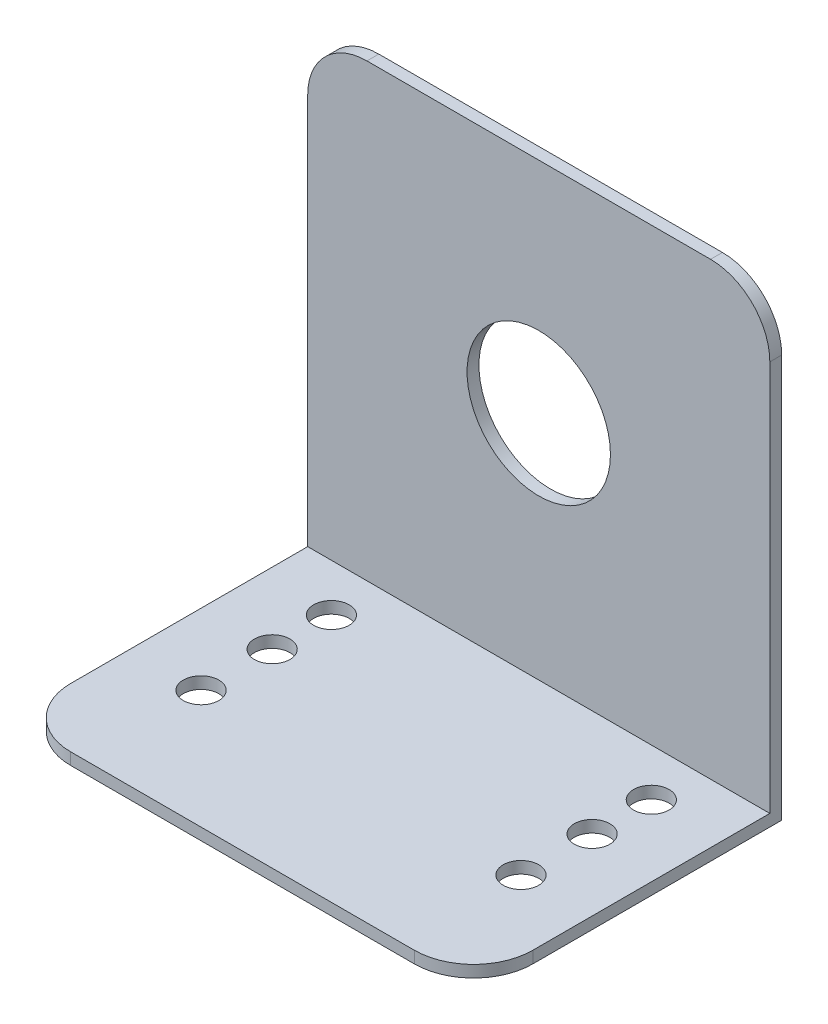
ISO-10303-21;
HEADER;
FILE_DESCRIPTION(('STEP AP214'),'2;1');
FILE_NAME('part.step','',(''),(''),'','','');
FILE_SCHEMA(('AUTOMOTIVE_DESIGN { 1 0 10303 214 1 1 1 1 }'));
ENDSEC;
DATA;
#1=APPLICATION_CONTEXT('core data for automotive mechanical design processes');
#2=APPLICATION_PROTOCOL_DEFINITION('international standard','automotive_design',2000,#1);
#3=PRODUCT_CONTEXT('',#1,'mechanical');
#4=PRODUCT('Part','Part','',(#3));
#5=PRODUCT_RELATED_PRODUCT_CATEGORY('part','',(#4));
#6=PRODUCT_DEFINITION_FORMATION('','',#4);
#7=PRODUCT_DEFINITION_CONTEXT('part definition',#1,'design');
#8=PRODUCT_DEFINITION('design','',#6,#7);
#9=PRODUCT_DEFINITION_SHAPE('','',#8);
#10=(LENGTH_UNIT() NAMED_UNIT(*) SI_UNIT(.MILLI.,.METRE.));
#11=(NAMED_UNIT(*) PLANE_ANGLE_UNIT() SI_UNIT($,.RADIAN.));
#12=(NAMED_UNIT(*) SI_UNIT($,.STERADIAN.) SOLID_ANGLE_UNIT());
#13=UNCERTAINTY_MEASURE_WITH_UNIT(LENGTH_MEASURE(1.E-05),#10,'distance_accuracy_value','');
#14=(GEOMETRIC_REPRESENTATION_CONTEXT(3) GLOBAL_UNCERTAINTY_ASSIGNED_CONTEXT((#13)) GLOBAL_UNIT_ASSIGNED_CONTEXT((#10,
#11,#12)) REPRESENTATION_CONTEXT('',''));
#15=CARTESIAN_POINT('',(0.,0.,0.));
#16=DIRECTION('',(0.,0.,1.));
#17=DIRECTION('',(1.,0.,0.));
#18=AXIS2_PLACEMENT_3D('',#15,#16,#17);
#19=CARTESIAN_POINT('',(0.,0.,1.));
#20=DIRECTION('',(0.,0.,-1.));
#21=DIRECTION('',(-1.,0.,0.));
#22=AXIS2_PLACEMENT_3D('',#19,#20,#21);
#23=PLANE('',#22);
#24=CARTESIAN_POINT('',(0.,1.,1.));
#25=DIRECTION('',(0.,0.,1.));
#26=DIRECTION('',(1.,0.,0.));
#27=AXIS2_PLACEMENT_3D('',#24,#25,#26);
#28=CIRCLE('',#27,6.05);
#29=CARTESIAN_POINT('',(6.05,1.,1.));
#30=VERTEX_POINT('',#29);
#31=EDGE_CURVE('E400',#30,#30,#28,.T.);
#32=ORIENTED_EDGE('',*,*,#31,.F.);
#33=EDGE_LOOP('',(#32));
#34=FACE_BOUND('',#33,.T.);
#35=DIRECTION('',(0.,1.,0.));
#36=VECTOR('',#35,1.);
#37=CARTESIAN_POINT('',(19.5,-19.5,1.));
#38=LINE('',#37,#36);
#39=CARTESIAN_POINT('',(19.5,-18.5,1.));
#40=VERTEX_POINT('',#39);
#41=CARTESIAN_POINT('',(19.5,14.5,1.));
#42=VERTEX_POINT('',#41);
#43=EDGE_CURVE('E146',#40,#42,#38,.T.);
#44=ORIENTED_EDGE('',*,*,#43,.T.);
#45=CARTESIAN_POINT('',(14.5,14.5,1.));
#46=DIRECTION('',(0.,0.,-1.));
#47=DIRECTION('',(-1.,0.,0.));
#48=AXIS2_PLACEMENT_3D('',#45,#46,#47);
#49=CIRCLE('',#48,5.);
#50=CARTESIAN_POINT('',(14.5,19.5,1.));
#51=VERTEX_POINT('',#50);
#52=EDGE_CURVE('E11',#42,#51,#49,.F.);
#53=ORIENTED_EDGE('',*,*,#52,.T.);
#54=DIRECTION('',(-1.,0.,0.));
#55=VECTOR('',#54,1.);
#56=CARTESIAN_POINT('',(-19.5,19.5,1.));
#57=LINE('',#56,#55);
#58=CARTESIAN_POINT('',(-14.5,19.5,1.));
#59=VERTEX_POINT('',#58);
#60=EDGE_CURVE('E119',#51,#59,#57,.T.);
#61=ORIENTED_EDGE('',*,*,#60,.T.);
#62=CARTESIAN_POINT('',(-14.5,14.5,1.));
#63=DIRECTION('',(0.,0.,-1.));
#64=DIRECTION('',(-1.,0.,0.));
#65=AXIS2_PLACEMENT_3D('',#62,#63,#64);
#66=CIRCLE('',#65,5.);
#67=CARTESIAN_POINT('',(-19.5,14.5,1.));
#68=VERTEX_POINT('',#67);
#69=EDGE_CURVE('E41',#59,#68,#66,.F.);
#70=ORIENTED_EDGE('',*,*,#69,.T.);
#71=DIRECTION('',(0.,-1.,0.));
#72=VECTOR('',#71,1.);
#73=CARTESIAN_POINT('',(-19.5,-19.5,1.));
#74=LINE('',#73,#72);
#75=CARTESIAN_POINT('',(-19.5,-18.5,1.));
#76=VERTEX_POINT('',#75);
#77=EDGE_CURVE('E109',#68,#76,#74,.T.);
#78=ORIENTED_EDGE('',*,*,#77,.T.);
#79=DIRECTION('',(-1.,0.,0.));
#80=VECTOR('',#79,1.);
#81=CARTESIAN_POINT('',(19.5,-18.5,1.));
#82=LINE('',#81,#80);
#83=EDGE_CURVE('E112',#40,#76,#82,.T.);
#84=ORIENTED_EDGE('',*,*,#83,.F.);
#85=EDGE_LOOP('',(#44,#53,#61,#70,#78,#84));
#86=FACE_BOUND('',#85,.T.);
#87=ADVANCED_FACE('F33',(#34,#86),#23,.F.);
#88=CARTESIAN_POINT('',(19.5,-19.5,1.));
#89=DIRECTION('',(-1.,0.,0.));
#90=DIRECTION('',(0.,0.,1.));
#91=AXIS2_PLACEMENT_3D('',#88,#89,#90);
#92=PLANE('',#91);
#93=DIRECTION('',(0.,0.,-1.));
#94=VECTOR('',#93,1.);
#95=CARTESIAN_POINT('',(19.5,-18.5,26.));
#96=LINE('',#95,#94);
#97=CARTESIAN_POINT('',(19.5,-18.5,21.));
#98=VERTEX_POINT('',#97);
#99=EDGE_CURVE('E129',#98,#40,#96,.T.);
#100=ORIENTED_EDGE('',*,*,#99,.F.);
#101=DIRECTION('',(0.,1.,0.));
#102=VECTOR('',#101,1.);
#103=CARTESIAN_POINT('',(19.5,-19.5,21.));
#104=LINE('',#103,#102);
#105=CARTESIAN_POINT('',(19.5,-19.5,21.));
#106=VERTEX_POINT('',#105);
#107=EDGE_CURVE('E181',#98,#106,#104,.F.);
#108=ORIENTED_EDGE('',*,*,#107,.T.);
#109=DIRECTION('',(0.,0.,-1.));
#110=VECTOR('',#109,1.);
#111=CARTESIAN_POINT('',(19.5,-19.5,1.));
#112=LINE('',#111,#110);
#113=CARTESIAN_POINT('',(19.5,-19.5,0.));
#114=VERTEX_POINT('',#113);
#115=EDGE_CURVE('E118',#106,#114,#112,.T.);
#116=ORIENTED_EDGE('',*,*,#115,.T.);
#117=DIRECTION('',(0.,1.,0.));
#118=VECTOR('',#117,1.);
#119=CARTESIAN_POINT('',(19.5,-19.5,0.));
#120=LINE('',#119,#118);
#121=CARTESIAN_POINT('',(19.5,14.5,0.));
#122=VERTEX_POINT('',#121);
#123=EDGE_CURVE('E145',#114,#122,#120,.T.);
#124=ORIENTED_EDGE('',*,*,#123,.T.);
#125=DIRECTION('',(0.,0.,-1.));
#126=VECTOR('',#125,1.);
#127=CARTESIAN_POINT('',(19.5,14.5,1.));
#128=LINE('',#127,#126);
#129=EDGE_CURVE('E179',#122,#42,#128,.F.);
#130=ORIENTED_EDGE('',*,*,#129,.T.);
#131=ORIENTED_EDGE('',*,*,#43,.F.);
#132=EDGE_LOOP('',(#100,#108,#116,#124,#130,#131));
#133=FACE_BOUND('',#132,.T.);
#134=ADVANCED_FACE('F199',(#133),#92,.F.);
#135=CARTESIAN_POINT('',(-19.5,19.5,1.));
#136=DIRECTION('',(0.,-1.,0.));
#137=DIRECTION('',(0.,0.,-1.));
#138=AXIS2_PLACEMENT_3D('',#135,#136,#137);
#139=PLANE('',#138);
#140=ORIENTED_EDGE('',*,*,#60,.F.);
#141=DIRECTION('',(0.,0.,-1.));
#142=VECTOR('',#141,1.);
#143=CARTESIAN_POINT('',(14.5,19.5,1.));
#144=LINE('',#143,#142);
#145=CARTESIAN_POINT('',(14.5,19.5,0.));
#146=VERTEX_POINT('',#145);
#147=EDGE_CURVE('E184',#51,#146,#144,.T.);
#148=ORIENTED_EDGE('',*,*,#147,.T.);
#149=DIRECTION('',(-1.,0.,0.));
#150=VECTOR('',#149,1.);
#151=CARTESIAN_POINT('',(-19.5,19.5,0.));
#152=LINE('',#151,#150);
#153=CARTESIAN_POINT('',(-14.5,19.5,0.));
#154=VERTEX_POINT('',#153);
#155=EDGE_CURVE('E152',#146,#154,#152,.T.);
#156=ORIENTED_EDGE('',*,*,#155,.T.);
#157=DIRECTION('',(0.,0.,-1.));
#158=VECTOR('',#157,1.);
#159=CARTESIAN_POINT('',(-14.5,19.5,1.));
#160=LINE('',#159,#158);
#161=EDGE_CURVE('E48',#154,#59,#160,.F.);
#162=ORIENTED_EDGE('',*,*,#161,.T.);
#163=EDGE_LOOP('',(#140,#148,#156,#162));
#164=FACE_BOUND('',#163,.T.);
#165=ADVANCED_FACE('F202',(#164),#139,.F.);
#166=CARTESIAN_POINT('',(-19.5,-19.5,1.));
#167=DIRECTION('',(1.,0.,0.));
#168=DIRECTION('',(0.,0.,-1.));
#169=AXIS2_PLACEMENT_3D('',#166,#167,#168);
#170=PLANE('',#169);
#171=DIRECTION('',(0.,0.,-1.));
#172=VECTOR('',#171,1.);
#173=CARTESIAN_POINT('',(-19.5,-19.5,1.));
#174=LINE('',#173,#172);
#175=CARTESIAN_POINT('',(-19.5,-19.5,21.));
#176=VERTEX_POINT('',#175);
#177=CARTESIAN_POINT('',(-19.5,-19.5,0.));
#178=VERTEX_POINT('',#177);
#179=EDGE_CURVE('E159',#176,#178,#174,.T.);
#180=ORIENTED_EDGE('',*,*,#179,.F.);
#181=DIRECTION('',(0.,-1.,0.));
#182=VECTOR('',#181,1.);
#183=CARTESIAN_POINT('',(-19.5,-18.5,21.));
#184=LINE('',#183,#182);
#185=CARTESIAN_POINT('',(-19.5,-18.5,21.));
#186=VERTEX_POINT('',#185);
#187=EDGE_CURVE('E126',#176,#186,#184,.F.);
#188=ORIENTED_EDGE('',*,*,#187,.T.);
#189=DIRECTION('',(0.,0.,-1.));
#190=VECTOR('',#189,1.);
#191=CARTESIAN_POINT('',(-19.5,-18.5,26.));
#192=LINE('',#191,#190);
#193=EDGE_CURVE('E122',#186,#76,#192,.T.);
#194=ORIENTED_EDGE('',*,*,#193,.T.);
#195=ORIENTED_EDGE('',*,*,#77,.F.);
#196=DIRECTION('',(0.,0.,-1.));
#197=VECTOR('',#196,1.);
#198=CARTESIAN_POINT('',(-19.5,14.5,1.));
#199=LINE('',#198,#197);
#200=CARTESIAN_POINT('',(-19.5,14.5,0.));
#201=VERTEX_POINT('',#200);
#202=EDGE_CURVE('E172',#68,#201,#199,.T.);
#203=ORIENTED_EDGE('',*,*,#202,.T.);
#204=DIRECTION('',(0.,-1.,0.));
#205=VECTOR('',#204,1.);
#206=CARTESIAN_POINT('',(-19.5,-19.5,0.));
#207=LINE('',#206,#205);
#208=EDGE_CURVE('E154',#201,#178,#207,.T.);
#209=ORIENTED_EDGE('',*,*,#208,.T.);
#210=EDGE_LOOP('',(#180,#188,#194,#195,#203,#209));
#211=FACE_BOUND('',#210,.T.);
#212=ADVANCED_FACE('F124',(#211),#170,.F.);
#213=CARTESIAN_POINT('',(-19.5,-19.5,1.));
#214=DIRECTION('',(0.,1.,0.));
#215=DIRECTION('',(0.,0.,1.));
#216=AXIS2_PLACEMENT_3D('',#213,#214,#215);
#217=PLANE('',#216);
#218=CARTESIAN_POINT('',(-13.5,-19.5,10.));
#219=DIRECTION('',(0.,-1.,0.));
#220=DIRECTION('',(0.,0.,-1.));
#221=AXIS2_PLACEMENT_3D('',#218,#219,#220);
#222=CIRCLE('',#221,1.5);
#223=CARTESIAN_POINT('',(-13.5,-19.5,8.5));
#224=VERTEX_POINT('',#223);
#225=EDGE_CURVE('E412',#224,#224,#222,.T.);
#226=ORIENTED_EDGE('',*,*,#225,.F.);
#227=EDGE_LOOP('',(#226));
#228=FACE_BOUND('',#227,.T.);
#229=CARTESIAN_POINT('',(-13.5,-19.5,5.));
#230=DIRECTION('',(0.,-1.,0.));
#231=DIRECTION('',(0.,0.,-1.));
#232=AXIS2_PLACEMENT_3D('',#229,#230,#231);
#233=CIRCLE('',#232,1.5);
#234=CARTESIAN_POINT('',(-13.5,-19.5,3.5));
#235=VERTEX_POINT('',#234);
#236=EDGE_CURVE('E405',#235,#235,#233,.T.);
#237=ORIENTED_EDGE('',*,*,#236,.F.);
#238=EDGE_LOOP('',(#237));
#239=FACE_BOUND('',#238,.T.);
#240=CARTESIAN_POINT('',(-13.5,-19.5,16.));
#241=DIRECTION('',(0.,-1.,0.));
#242=DIRECTION('',(0.,0.,-1.));
#243=AXIS2_PLACEMENT_3D('',#240,#241,#242);
#244=CIRCLE('',#243,1.5);
#245=CARTESIAN_POINT('',(-13.5,-19.5,14.5));
#246=VERTEX_POINT('',#245);
#247=EDGE_CURVE('E411',#246,#246,#244,.T.);
#248=ORIENTED_EDGE('',*,*,#247,.F.);
#249=EDGE_LOOP('',(#248));
#250=FACE_BOUND('',#249,.T.);
#251=CARTESIAN_POINT('',(13.5,-19.5,10.));
#252=DIRECTION('',(0.,-1.,0.));
#253=DIRECTION('',(0.,0.,-1.));
#254=AXIS2_PLACEMENT_3D('',#251,#252,#253);
#255=CIRCLE('',#254,1.5);
#256=CARTESIAN_POINT('',(13.5,-19.5,8.5));
#257=VERTEX_POINT('',#256);
#258=EDGE_CURVE('E429',#257,#257,#255,.T.);
#259=ORIENTED_EDGE('',*,*,#258,.F.);
#260=EDGE_LOOP('',(#259));
#261=FACE_BOUND('',#260,.T.);
#262=CARTESIAN_POINT('',(13.5,-19.5,16.));
#263=DIRECTION('',(0.,-1.,0.));
#264=DIRECTION('',(0.,0.,-1.));
#265=AXIS2_PLACEMENT_3D('',#262,#263,#264);
#266=CIRCLE('',#265,1.5);
#267=CARTESIAN_POINT('',(13.5,-19.5,14.5));
#268=VERTEX_POINT('',#267);
#269=EDGE_CURVE('E423',#268,#268,#266,.T.);
#270=ORIENTED_EDGE('',*,*,#269,.F.);
#271=EDGE_LOOP('',(#270));
#272=FACE_BOUND('',#271,.T.);
#273=CARTESIAN_POINT('',(13.5,-19.5,5.));
#274=DIRECTION('',(0.,-1.,0.));
#275=DIRECTION('',(0.,0.,-1.));
#276=AXIS2_PLACEMENT_3D('',#273,#274,#275);
#277=CIRCLE('',#276,1.5);
#278=CARTESIAN_POINT('',(13.5,-19.5,3.5));
#279=VERTEX_POINT('',#278);
#280=EDGE_CURVE('E140',#279,#279,#277,.T.);
#281=ORIENTED_EDGE('',*,*,#280,.F.);
#282=EDGE_LOOP('',(#281));
#283=FACE_BOUND('',#282,.T.);
#284=DIRECTION('',(1.,0.,0.));
#285=VECTOR('',#284,1.);
#286=CARTESIAN_POINT('',(-19.5,-19.5,26.));
#287=LINE('',#286,#285);
#288=CARTESIAN_POINT('',(-14.5,-19.5,26.));
#289=VERTEX_POINT('',#288);
#290=CARTESIAN_POINT('',(14.5,-19.5,26.));
#291=VERTEX_POINT('',#290);
#292=EDGE_CURVE('E134',#289,#291,#287,.T.);
#293=ORIENTED_EDGE('',*,*,#292,.F.);
#294=CARTESIAN_POINT('',(-14.5,-19.5,21.));
#295=DIRECTION('',(0.,1.,0.));
#296=DIRECTION('',(0.,0.,1.));
#297=AXIS2_PLACEMENT_3D('',#294,#295,#296);
#298=CIRCLE('',#297,5.);
#299=EDGE_CURVE('E170',#289,#176,#298,.F.);
#300=ORIENTED_EDGE('',*,*,#299,.T.);
#301=ORIENTED_EDGE('',*,*,#179,.T.);
#302=DIRECTION('',(1.,0.,0.));
#303=VECTOR('',#302,1.);
#304=CARTESIAN_POINT('',(-19.5,-19.5,0.));
#305=LINE('',#304,#303);
#306=EDGE_CURVE('E148',#178,#114,#305,.T.);
#307=ORIENTED_EDGE('',*,*,#306,.T.);
#308=ORIENTED_EDGE('',*,*,#115,.F.);
#309=CARTESIAN_POINT('',(14.5,-19.5,21.));
#310=DIRECTION('',(0.,1.,0.));
#311=DIRECTION('',(0.,0.,1.));
#312=AXIS2_PLACEMENT_3D('',#309,#310,#311);
#313=CIRCLE('',#312,5.);
#314=EDGE_CURVE('E168',#106,#291,#313,.F.);
#315=ORIENTED_EDGE('',*,*,#314,.T.);
#316=EDGE_LOOP('',(#293,#300,#301,#307,#308,#315));
#317=FACE_BOUND('',#316,.T.);
#318=ADVANCED_FACE('F207',(#228,#239,#250,#261,#272,#283,#317),#217,.F.);
#319=CARTESIAN_POINT('',(0.,0.,0.));
#320=DIRECTION('',(0.,0.,-1.));
#321=DIRECTION('',(-1.,0.,0.));
#322=AXIS2_PLACEMENT_3D('',#319,#320,#321);
#323=PLANE('',#322);
#324=CARTESIAN_POINT('',(0.,1.,0.));
#325=DIRECTION('',(0.,0.,1.));
#326=DIRECTION('',(1.,0.,0.));
#327=AXIS2_PLACEMENT_3D('',#324,#325,#326);
#328=CIRCLE('',#327,6.05);
#329=CARTESIAN_POINT('',(6.05,1.,0.));
#330=VERTEX_POINT('',#329);
#331=EDGE_CURVE('E403',#330,#330,#328,.T.);
#332=ORIENTED_EDGE('',*,*,#331,.T.);
#333=EDGE_LOOP('',(#332));
#334=FACE_BOUND('',#333,.T.);
#335=ORIENTED_EDGE('',*,*,#155,.F.);
#336=CARTESIAN_POINT('',(14.5,14.5,0.));
#337=DIRECTION('',(0.,0.,-1.));
#338=DIRECTION('',(-1.,0.,0.));
#339=AXIS2_PLACEMENT_3D('',#336,#337,#338);
#340=CIRCLE('',#339,5.);
#341=EDGE_CURVE('E189',#146,#122,#340,.T.);
#342=ORIENTED_EDGE('',*,*,#341,.T.);
#343=ORIENTED_EDGE('',*,*,#123,.F.);
#344=ORIENTED_EDGE('',*,*,#306,.F.);
#345=ORIENTED_EDGE('',*,*,#208,.F.);
#346=CARTESIAN_POINT('',(-14.5,14.5,0.));
#347=DIRECTION('',(0.,0.,-1.));
#348=DIRECTION('',(-1.,0.,0.));
#349=AXIS2_PLACEMENT_3D('',#346,#347,#348);
#350=CIRCLE('',#349,5.);
#351=EDGE_CURVE('E187',#201,#154,#350,.T.);
#352=ORIENTED_EDGE('',*,*,#351,.T.);
#353=EDGE_LOOP('',(#335,#342,#343,#344,#345,#352));
#354=FACE_BOUND('',#353,.T.);
#355=ADVANCED_FACE('F193',(#334,#354),#323,.T.);
#356=CARTESIAN_POINT('',(19.5,-18.5,26.));
#357=DIRECTION('',(0.,-1.,0.));
#358=DIRECTION('',(1.,0.,0.));
#359=AXIS2_PLACEMENT_3D('',#356,#357,#358);
#360=PLANE('',#359);
#361=CARTESIAN_POINT('',(-13.5,-18.5,10.));
#362=DIRECTION('',(0.,-1.,0.));
#363=DIRECTION('',(0.,0.,-1.));
#364=AXIS2_PLACEMENT_3D('',#361,#362,#363);
#365=CIRCLE('',#364,1.5);
#366=CARTESIAN_POINT('',(-13.5,-18.5,8.5));
#367=VERTEX_POINT('',#366);
#368=EDGE_CURVE('E408',#367,#367,#365,.T.);
#369=ORIENTED_EDGE('',*,*,#368,.T.);
#370=EDGE_LOOP('',(#369));
#371=FACE_BOUND('',#370,.T.);
#372=CARTESIAN_POINT('',(-13.5,-18.5,5.));
#373=DIRECTION('',(0.,-1.,0.));
#374=DIRECTION('',(0.,0.,-1.));
#375=AXIS2_PLACEMENT_3D('',#372,#373,#374);
#376=CIRCLE('',#375,1.5);
#377=CARTESIAN_POINT('',(-13.5,-18.5,3.5));
#378=VERTEX_POINT('',#377);
#379=EDGE_CURVE('E415',#378,#378,#376,.T.);
#380=ORIENTED_EDGE('',*,*,#379,.T.);
#381=EDGE_LOOP('',(#380));
#382=FACE_BOUND('',#381,.T.);
#383=CARTESIAN_POINT('',(-13.5,-18.5,16.));
#384=DIRECTION('',(0.,-1.,0.));
#385=DIRECTION('',(0.,0.,-1.));
#386=AXIS2_PLACEMENT_3D('',#383,#384,#385);
#387=CIRCLE('',#386,1.5);
#388=CARTESIAN_POINT('',(-13.5,-18.5,14.5));
#389=VERTEX_POINT('',#388);
#390=EDGE_CURVE('E420',#389,#389,#387,.T.);
#391=ORIENTED_EDGE('',*,*,#390,.T.);
#392=EDGE_LOOP('',(#391));
#393=FACE_BOUND('',#392,.T.);
#394=CARTESIAN_POINT('',(13.5,-18.5,10.));
#395=DIRECTION('',(0.,-1.,0.));
#396=DIRECTION('',(0.,0.,-1.));
#397=AXIS2_PLACEMENT_3D('',#394,#395,#396);
#398=CIRCLE('',#397,1.5);
#399=CARTESIAN_POINT('',(13.5,-18.5,8.5));
#400=VERTEX_POINT('',#399);
#401=EDGE_CURVE('E426',#400,#400,#398,.T.);
#402=ORIENTED_EDGE('',*,*,#401,.T.);
#403=EDGE_LOOP('',(#402));
#404=FACE_BOUND('',#403,.T.);
#405=CARTESIAN_POINT('',(13.5,-18.5,16.));
#406=DIRECTION('',(0.,-1.,0.));
#407=DIRECTION('',(0.,0.,-1.));
#408=AXIS2_PLACEMENT_3D('',#405,#406,#407);
#409=CIRCLE('',#408,1.5);
#410=CARTESIAN_POINT('',(13.5,-18.5,14.5));
#411=VERTEX_POINT('',#410);
#412=EDGE_CURVE('E432',#411,#411,#409,.T.);
#413=ORIENTED_EDGE('',*,*,#412,.T.);
#414=EDGE_LOOP('',(#413));
#415=FACE_BOUND('',#414,.T.);
#416=CARTESIAN_POINT('',(13.5,-18.5,5.));
#417=DIRECTION('',(0.,-1.,0.));
#418=DIRECTION('',(0.,0.,-1.));
#419=AXIS2_PLACEMENT_3D('',#416,#417,#418);
#420=CIRCLE('',#419,1.5);
#421=CARTESIAN_POINT('',(13.5,-18.5,3.5));
#422=VERTEX_POINT('',#421);
#423=EDGE_CURVE('E135',#422,#422,#420,.T.);
#424=ORIENTED_EDGE('',*,*,#423,.T.);
#425=EDGE_LOOP('',(#424));
#426=FACE_BOUND('',#425,.T.);
#427=ORIENTED_EDGE('',*,*,#193,.F.);
#428=CARTESIAN_POINT('',(-14.5,-18.5,21.));
#429=DIRECTION('',(0.,-1.,0.));
#430=DIRECTION('',(1.,0.,0.));
#431=AXIS2_PLACEMENT_3D('',#428,#429,#430);
#432=CIRCLE('',#431,5.);
#433=CARTESIAN_POINT('',(-14.5,-18.5,26.));
#434=VERTEX_POINT('',#433);
#435=EDGE_CURVE('E177',#186,#434,#432,.F.);
#436=ORIENTED_EDGE('',*,*,#435,.T.);
#437=DIRECTION('',(-1.,0.,0.));
#438=VECTOR('',#437,1.);
#439=CARTESIAN_POINT('',(19.5,-18.5,26.));
#440=LINE('',#439,#438);
#441=CARTESIAN_POINT('',(14.5,-18.5,26.));
#442=VERTEX_POINT('',#441);
#443=EDGE_CURVE('E130',#442,#434,#440,.T.);
#444=ORIENTED_EDGE('',*,*,#443,.F.);
#445=CARTESIAN_POINT('',(14.5,-18.5,21.));
#446=DIRECTION('',(0.,-1.,0.));
#447=DIRECTION('',(1.,0.,0.));
#448=AXIS2_PLACEMENT_3D('',#445,#446,#447);
#449=CIRCLE('',#448,5.);
#450=EDGE_CURVE('E175',#442,#98,#449,.F.);
#451=ORIENTED_EDGE('',*,*,#450,.T.);
#452=ORIENTED_EDGE('',*,*,#99,.T.);
#453=ORIENTED_EDGE('',*,*,#83,.T.);
#454=EDGE_LOOP('',(#427,#436,#444,#451,#452,#453));
#455=FACE_BOUND('',#454,.T.);
#456=ADVANCED_FACE('F132',(#371,#382,#393,#404,#415,#426,#455),#360,.F.);
#457=CARTESIAN_POINT('',(0.,0.,26.));
#458=DIRECTION('',(0.,0.,1.));
#459=DIRECTION('',(1.,0.,0.));
#460=AXIS2_PLACEMENT_3D('',#457,#458,#459);
#461=PLANE('',#460);
#462=ORIENTED_EDGE('',*,*,#443,.T.);
#463=DIRECTION('',(0.,-1.,0.));
#464=VECTOR('',#463,1.);
#465=CARTESIAN_POINT('',(-14.5,-19.5,26.));
#466=LINE('',#465,#464);
#467=EDGE_CURVE('E165',#434,#289,#466,.T.);
#468=ORIENTED_EDGE('',*,*,#467,.T.);
#469=ORIENTED_EDGE('',*,*,#292,.T.);
#470=DIRECTION('',(0.,1.,0.));
#471=VECTOR('',#470,1.);
#472=CARTESIAN_POINT('',(14.5,-18.5,26.));
#473=LINE('',#472,#471);
#474=EDGE_CURVE('E162',#291,#442,#473,.T.);
#475=ORIENTED_EDGE('',*,*,#474,.T.);
#476=EDGE_LOOP('',(#462,#468,#469,#475));
#477=FACE_BOUND('',#476,.T.);
#478=ADVANCED_FACE('F215',(#477),#461,.T.);
#479=CARTESIAN_POINT('',(13.5,-18.5,5.));
#480=DIRECTION('',(0.,-1.,0.));
#481=DIRECTION('',(0.,0.,-1.));
#482=AXIS2_PLACEMENT_3D('',#479,#480,#481);
#483=CYLINDRICAL_SURFACE('',#482,1.5);
#484=ORIENTED_EDGE('',*,*,#423,.F.);
#485=EDGE_LOOP('',(#484));
#486=FACE_BOUND('',#485,.T.);
#487=ORIENTED_EDGE('',*,*,#280,.T.);
#488=EDGE_LOOP('',(#487));
#489=FACE_BOUND('',#488,.T.);
#490=ADVANCED_FACE('F277',(#486,#489),#483,.F.);
#491=CARTESIAN_POINT('',(13.5,-18.5,16.));
#492=DIRECTION('',(0.,-1.,0.));
#493=DIRECTION('',(0.,0.,-1.));
#494=AXIS2_PLACEMENT_3D('',#491,#492,#493);
#495=CYLINDRICAL_SURFACE('',#494,1.5);
#496=ORIENTED_EDGE('',*,*,#412,.F.);
#497=EDGE_LOOP('',(#496));
#498=FACE_BOUND('',#497,.T.);
#499=ORIENTED_EDGE('',*,*,#269,.T.);
#500=EDGE_LOOP('',(#499));
#501=FACE_BOUND('',#500,.T.);
#502=ADVANCED_FACE('F284',(#498,#501),#495,.F.);
#503=CARTESIAN_POINT('',(13.5,-18.5,10.));
#504=DIRECTION('',(0.,-1.,0.));
#505=DIRECTION('',(0.,0.,-1.));
#506=AXIS2_PLACEMENT_3D('',#503,#504,#505);
#507=CYLINDRICAL_SURFACE('',#506,1.5);
#508=ORIENTED_EDGE('',*,*,#401,.F.);
#509=EDGE_LOOP('',(#508));
#510=FACE_BOUND('',#509,.T.);
#511=ORIENTED_EDGE('',*,*,#258,.T.);
#512=EDGE_LOOP('',(#511));
#513=FACE_BOUND('',#512,.T.);
#514=ADVANCED_FACE('F292',(#510,#513),#507,.F.);
#515=CARTESIAN_POINT('',(-13.5,-18.5,16.));
#516=DIRECTION('',(0.,-1.,0.));
#517=DIRECTION('',(0.,0.,-1.));
#518=AXIS2_PLACEMENT_3D('',#515,#516,#517);
#519=CYLINDRICAL_SURFACE('',#518,1.5);
#520=ORIENTED_EDGE('',*,*,#390,.F.);
#521=EDGE_LOOP('',(#520));
#522=FACE_BOUND('',#521,.T.);
#523=ORIENTED_EDGE('',*,*,#247,.T.);
#524=EDGE_LOOP('',(#523));
#525=FACE_BOUND('',#524,.T.);
#526=ADVANCED_FACE('F300',(#522,#525),#519,.F.);
#527=CARTESIAN_POINT('',(-13.5,-18.5,5.));
#528=DIRECTION('',(0.,-1.,0.));
#529=DIRECTION('',(0.,0.,-1.));
#530=AXIS2_PLACEMENT_3D('',#527,#528,#529);
#531=CYLINDRICAL_SURFACE('',#530,1.5);
#532=ORIENTED_EDGE('',*,*,#379,.F.);
#533=EDGE_LOOP('',(#532));
#534=FACE_BOUND('',#533,.T.);
#535=ORIENTED_EDGE('',*,*,#236,.T.);
#536=EDGE_LOOP('',(#535));
#537=FACE_BOUND('',#536,.T.);
#538=ADVANCED_FACE('F308',(#534,#537),#531,.F.);
#539=CARTESIAN_POINT('',(-13.5,-18.5,10.));
#540=DIRECTION('',(0.,-1.,0.));
#541=DIRECTION('',(0.,0.,-1.));
#542=AXIS2_PLACEMENT_3D('',#539,#540,#541);
#543=CYLINDRICAL_SURFACE('',#542,1.5);
#544=ORIENTED_EDGE('',*,*,#368,.F.);
#545=EDGE_LOOP('',(#544));
#546=FACE_BOUND('',#545,.T.);
#547=ORIENTED_EDGE('',*,*,#225,.T.);
#548=EDGE_LOOP('',(#547));
#549=FACE_BOUND('',#548,.T.);
#550=ADVANCED_FACE('F226',(#546,#549),#543,.F.);
#551=CARTESIAN_POINT('',(-14.5,0.,21.));
#552=DIRECTION('',(0.,1.,0.));
#553=DIRECTION('',(0.,0.,1.));
#554=AXIS2_PLACEMENT_3D('',#551,#552,#553);
#555=CYLINDRICAL_SURFACE('',#554,5.);
#556=ORIENTED_EDGE('',*,*,#435,.F.);
#557=ORIENTED_EDGE('',*,*,#187,.F.);
#558=ORIENTED_EDGE('',*,*,#299,.F.);
#559=ORIENTED_EDGE('',*,*,#467,.F.);
#560=EDGE_LOOP('',(#556,#557,#558,#559));
#561=FACE_BOUND('',#560,.T.);
#562=ADVANCED_FACE('F210',(#561),#555,.T.);
#563=CARTESIAN_POINT('',(14.5,0.,21.));
#564=DIRECTION('',(0.,-1.,0.));
#565=DIRECTION('',(0.,0.,-1.));
#566=AXIS2_PLACEMENT_3D('',#563,#564,#565);
#567=CYLINDRICAL_SURFACE('',#566,5.);
#568=ORIENTED_EDGE('',*,*,#314,.F.);
#569=ORIENTED_EDGE('',*,*,#107,.F.);
#570=ORIENTED_EDGE('',*,*,#450,.F.);
#571=ORIENTED_EDGE('',*,*,#474,.F.);
#572=EDGE_LOOP('',(#568,#569,#570,#571));
#573=FACE_BOUND('',#572,.T.);
#574=ADVANCED_FACE('F218',(#573),#567,.T.);
#575=CARTESIAN_POINT('',(14.5,14.5,1.));
#576=DIRECTION('',(0.,0.,-1.));
#577=DIRECTION('',(-1.,0.,0.));
#578=AXIS2_PLACEMENT_3D('',#575,#576,#577);
#579=CYLINDRICAL_SURFACE('',#578,5.);
#580=ORIENTED_EDGE('',*,*,#52,.F.);
#581=ORIENTED_EDGE('',*,*,#129,.F.);
#582=ORIENTED_EDGE('',*,*,#341,.F.);
#583=ORIENTED_EDGE('',*,*,#147,.F.);
#584=EDGE_LOOP('',(#580,#581,#582,#583));
#585=FACE_BOUND('',#584,.T.);
#586=ADVANCED_FACE('F201',(#585),#579,.T.);
#587=CARTESIAN_POINT('',(-14.5,14.5,1.));
#588=DIRECTION('',(0.,0.,-1.));
#589=DIRECTION('',(-1.,0.,0.));
#590=AXIS2_PLACEMENT_3D('',#587,#588,#589);
#591=CYLINDRICAL_SURFACE('',#590,5.);
#592=ORIENTED_EDGE('',*,*,#69,.F.);
#593=ORIENTED_EDGE('',*,*,#161,.F.);
#594=ORIENTED_EDGE('',*,*,#351,.F.);
#595=ORIENTED_EDGE('',*,*,#202,.F.);
#596=EDGE_LOOP('',(#592,#593,#594,#595));
#597=FACE_BOUND('',#596,.T.);
#598=ADVANCED_FACE('F35',(#597),#591,.T.);
#599=CARTESIAN_POINT('',(0.,1.,1.));
#600=DIRECTION('',(0.,0.,-1.));
#601=DIRECTION('',(-1.,0.,0.));
#602=AXIS2_PLACEMENT_3D('',#599,#600,#601);
#603=CYLINDRICAL_SURFACE('',#602,6.05);
#604=ORIENTED_EDGE('',*,*,#31,.T.);
#605=EDGE_LOOP('',(#604));
#606=FACE_BOUND('',#605,.T.);
#607=ORIENTED_EDGE('',*,*,#331,.F.);
#608=EDGE_LOOP('',(#607));
#609=FACE_BOUND('',#608,.T.);
#610=ADVANCED_FACE('F345',(#606,#609),#603,.F.);
#611=CLOSED_SHELL('',(#87,#134,#165,#212,#318,#355,#456,#478,#490,#502,#514,#526,#538,#550,#562,
#574,#586,#598,#610));
#612=MANIFOLD_SOLID_BREP('B2',#611);
#613=ADVANCED_BREP_SHAPE_REPRESENTATION('',(#18,#612),#14);
#614=SHAPE_DEFINITION_REPRESENTATION(#9,#613);
ENDSEC;
END-ISO-10303-21;
